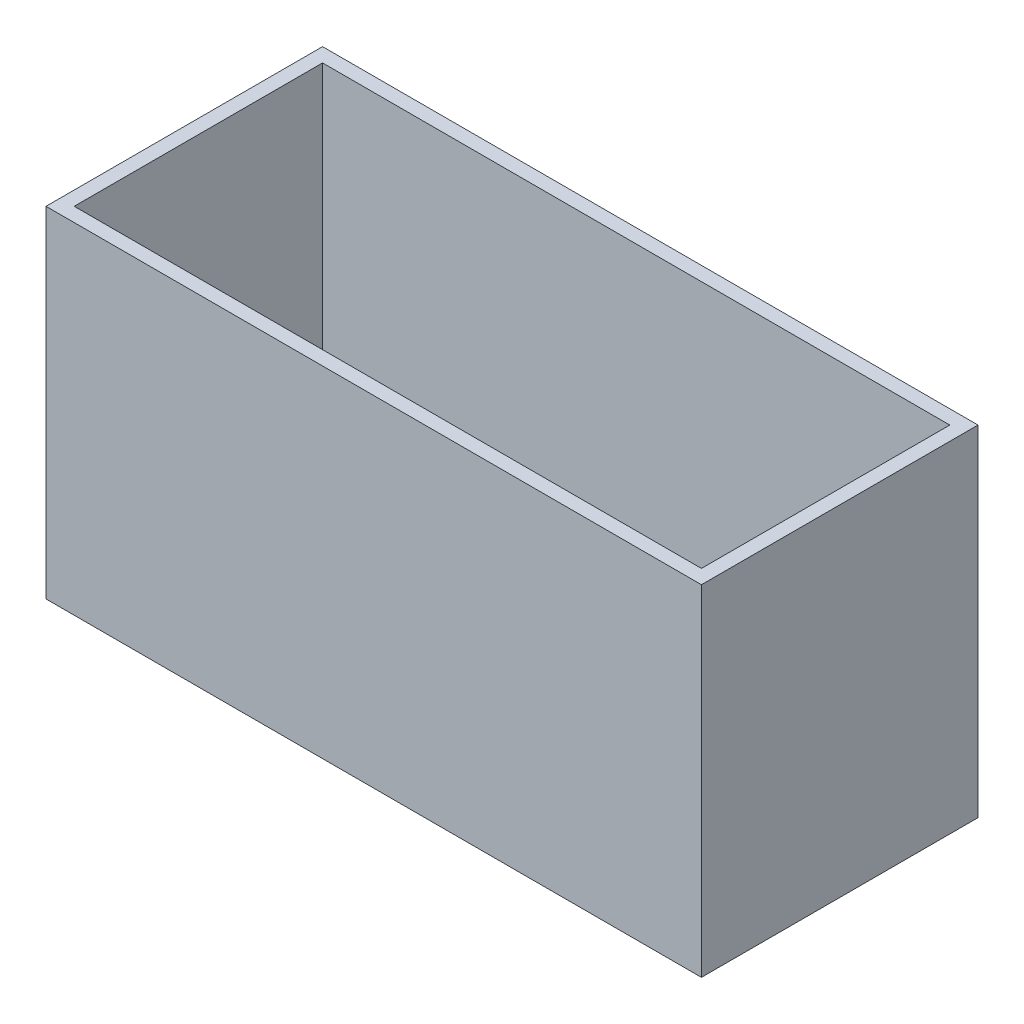
ISO-10303-21;
HEADER;
FILE_DESCRIPTION(('STEP AP214'),'2;1');
FILE_NAME('part.step','',(''),(''),'','','');
FILE_SCHEMA(('AUTOMOTIVE_DESIGN { 1 0 10303 214 1 1 1 1 }'));
ENDSEC;
DATA;
#1=APPLICATION_CONTEXT('core data for automotive mechanical design processes');
#2=APPLICATION_PROTOCOL_DEFINITION('international standard','automotive_design',2000,#1);
#3=PRODUCT_CONTEXT('',#1,'mechanical');
#4=PRODUCT('Part','Part','',(#3));
#5=PRODUCT_RELATED_PRODUCT_CATEGORY('part','',(#4));
#6=PRODUCT_DEFINITION_FORMATION('','',#4);
#7=PRODUCT_DEFINITION_CONTEXT('part definition',#1,'design');
#8=PRODUCT_DEFINITION('design','',#6,#7);
#9=PRODUCT_DEFINITION_SHAPE('','',#8);
#10=(LENGTH_UNIT() NAMED_UNIT(*) SI_UNIT(.MILLI.,.METRE.));
#11=(NAMED_UNIT(*) PLANE_ANGLE_UNIT() SI_UNIT($,.RADIAN.));
#12=(NAMED_UNIT(*) SI_UNIT($,.STERADIAN.) SOLID_ANGLE_UNIT());
#13=UNCERTAINTY_MEASURE_WITH_UNIT(LENGTH_MEASURE(1.E-05),#10,'distance_accuracy_value','');
#14=(GEOMETRIC_REPRESENTATION_CONTEXT(3) GLOBAL_UNCERTAINTY_ASSIGNED_CONTEXT((#13)) GLOBAL_UNIT_ASSIGNED_CONTEXT((#10,
#11,#12)) REPRESENTATION_CONTEXT('',''));
#15=CARTESIAN_POINT('',(0.,0.,0.));
#16=DIRECTION('',(0.,0.,1.));
#17=DIRECTION('',(1.,0.,0.));
#18=AXIS2_PLACEMENT_3D('',#15,#16,#17);
#19=CARTESIAN_POINT('',(0.,20.,0.));
#20=DIRECTION('',(0.,-1.,0.));
#21=DIRECTION('',(0.,0.,-1.));
#22=AXIS2_PLACEMENT_3D('',#19,#20,#21);
#23=PLANE('',#22);
#24=DIRECTION('',(0.,0.,-1.));
#25=VECTOR('',#24,1.);
#26=CARTESIAN_POINT('',(-444.5,20.,0.));
#27=LINE('',#26,#25);
#28=CARTESIAN_POINT('',(-444.5,20.,176.));
#29=VERTEX_POINT('',#28);
#30=CARTESIAN_POINT('',(-444.5,20.,-176.));
#31=VERTEX_POINT('',#30);
#32=EDGE_CURVE('E130',#29,#31,#27,.T.);
#33=ORIENTED_EDGE('',*,*,#32,.F.);
#34=DIRECTION('',(-1.,0.,0.));
#35=VECTOR('',#34,1.);
#36=CARTESIAN_POINT('',(0.,20.,176.));
#37=LINE('',#36,#35);
#38=CARTESIAN_POINT('',(444.5,20.,176.));
#39=VERTEX_POINT('',#38);
#40=EDGE_CURVE('E188',#39,#29,#37,.T.);
#41=ORIENTED_EDGE('',*,*,#40,.F.);
#42=DIRECTION('',(0.,0.,1.));
#43=VECTOR('',#42,1.);
#44=CARTESIAN_POINT('',(444.5,20.,0.));
#45=LINE('',#44,#43);
#46=CARTESIAN_POINT('',(444.5,20.,-176.));
#47=VERTEX_POINT('',#46);
#48=EDGE_CURVE('E194',#47,#39,#45,.T.);
#49=ORIENTED_EDGE('',*,*,#48,.F.);
#50=DIRECTION('',(1.,0.,0.));
#51=VECTOR('',#50,1.);
#52=CARTESIAN_POINT('',(0.,20.,-176.));
#53=LINE('',#52,#51);
#54=EDGE_CURVE('E140',#31,#47,#53,.T.);
#55=ORIENTED_EDGE('',*,*,#54,.F.);
#56=EDGE_LOOP('',(#33,#41,#49,#55));
#57=FACE_BOUND('',#56,.T.);
#58=ADVANCED_FACE('F45',(#57),#23,.F.);
#59=CARTESIAN_POINT('',(-464.5,482.,-176.));
#60=DIRECTION('',(0.,0.,-1.));
#61=DIRECTION('',(-1.,0.,0.));
#62=AXIS2_PLACEMENT_3D('',#59,#60,#61);
#63=PLANE('',#62);
#64=DIRECTION('',(0.,-1.,0.));
#65=VECTOR('',#64,1.);
#66=CARTESIAN_POINT('',(-444.5,482.,-176.));
#67=LINE('',#66,#65);
#68=CARTESIAN_POINT('',(-444.5,482.,-176.));
#69=VERTEX_POINT('',#68);
#70=EDGE_CURVE('E127',#69,#31,#67,.T.);
#71=ORIENTED_EDGE('',*,*,#70,.T.);
#72=ORIENTED_EDGE('',*,*,#54,.T.);
#73=DIRECTION('',(0.,-1.,0.));
#74=VECTOR('',#73,1.);
#75=CARTESIAN_POINT('',(444.5,482.,-176.));
#76=LINE('',#75,#74);
#77=CARTESIAN_POINT('',(444.5,482.,-176.));
#78=VERTEX_POINT('',#77);
#79=EDGE_CURVE('E138',#78,#47,#76,.T.);
#80=ORIENTED_EDGE('',*,*,#79,.F.);
#81=DIRECTION('',(1.,0.,0.));
#82=VECTOR('',#81,1.);
#83=CARTESIAN_POINT('',(-464.5,482.,-176.));
#84=LINE('',#83,#82);
#85=EDGE_CURVE('E118',#69,#78,#84,.T.);
#86=ORIENTED_EDGE('',*,*,#85,.F.);
#87=EDGE_LOOP('',(#71,#72,#80,#86));
#88=FACE_BOUND('',#87,.T.);
#89=ADVANCED_FACE('F136',(#88),#63,.F.);
#90=CARTESIAN_POINT('',(-464.5,482.,176.));
#91=DIRECTION('',(0.,0.,1.));
#92=DIRECTION('',(1.,0.,0.));
#93=AXIS2_PLACEMENT_3D('',#90,#91,#92);
#94=PLANE('',#93);
#95=DIRECTION('',(0.,-1.,0.));
#96=VECTOR('',#95,1.);
#97=CARTESIAN_POINT('',(-444.5,482.,176.));
#98=LINE('',#97,#96);
#99=CARTESIAN_POINT('',(-444.5,482.,176.));
#100=VERTEX_POINT('',#99);
#101=EDGE_CURVE('E124',#100,#29,#98,.T.);
#102=ORIENTED_EDGE('',*,*,#101,.F.);
#103=DIRECTION('',(-1.,0.,0.));
#104=VECTOR('',#103,1.);
#105=CARTESIAN_POINT('',(-464.5,482.,176.));
#106=LINE('',#105,#104);
#107=CARTESIAN_POINT('',(444.5,482.,176.));
#108=VERTEX_POINT('',#107);
#109=EDGE_CURVE('E120',#108,#100,#106,.T.);
#110=ORIENTED_EDGE('',*,*,#109,.F.);
#111=DIRECTION('',(0.,-1.,0.));
#112=VECTOR('',#111,1.);
#113=CARTESIAN_POINT('',(444.5,482.,176.));
#114=LINE('',#113,#112);
#115=EDGE_CURVE('E61',#108,#39,#114,.T.);
#116=ORIENTED_EDGE('',*,*,#115,.T.);
#117=ORIENTED_EDGE('',*,*,#40,.T.);
#118=EDGE_LOOP('',(#102,#110,#116,#117));
#119=FACE_BOUND('',#118,.T.);
#120=ADVANCED_FACE('F208',(#119),#94,.F.);
#121=CARTESIAN_POINT('',(464.5,20.,196.));
#122=DIRECTION('',(-1.,0.,0.));
#123=DIRECTION('',(0.,0.,1.));
#124=AXIS2_PLACEMENT_3D('',#121,#122,#123);
#125=PLANE('',#124);
#126=DIRECTION('',(0.,0.,-1.));
#127=VECTOR('',#126,1.);
#128=CARTESIAN_POINT('',(464.5,0.,196.));
#129=LINE('',#128,#127);
#130=CARTESIAN_POINT('',(464.5,0.,196.));
#131=VERTEX_POINT('',#130);
#132=CARTESIAN_POINT('',(464.5,0.,-196.));
#133=VERTEX_POINT('',#132);
#134=EDGE_CURVE('E145',#131,#133,#129,.T.);
#135=ORIENTED_EDGE('',*,*,#134,.T.);
#136=DIRECTION('',(0.,-1.,0.));
#137=VECTOR('',#136,1.);
#138=CARTESIAN_POINT('',(464.5,20.,-196.));
#139=LINE('',#138,#137);
#140=CARTESIAN_POINT('',(464.5,482.,-196.));
#141=VERTEX_POINT('',#140);
#142=EDGE_CURVE('E11',#141,#133,#139,.T.);
#143=ORIENTED_EDGE('',*,*,#142,.F.);
#144=DIRECTION('',(0.,0.,-1.));
#145=VECTOR('',#144,1.);
#146=CARTESIAN_POINT('',(464.5,482.,-176.));
#147=LINE('',#146,#145);
#148=CARTESIAN_POINT('',(464.5,482.,196.));
#149=VERTEX_POINT('',#148);
#150=EDGE_CURVE('E182',#149,#141,#147,.T.);
#151=ORIENTED_EDGE('',*,*,#150,.F.);
#152=DIRECTION('',(0.,-1.,0.));
#153=VECTOR('',#152,1.);
#154=CARTESIAN_POINT('',(464.5,20.,196.));
#155=LINE('',#154,#153);
#156=EDGE_CURVE('E161',#149,#131,#155,.T.);
#157=ORIENTED_EDGE('',*,*,#156,.T.);
#158=EDGE_LOOP('',(#135,#143,#151,#157));
#159=FACE_BOUND('',#158,.T.);
#160=ADVANCED_FACE('F47',(#159),#125,.F.);
#161=CARTESIAN_POINT('',(-464.5,20.,-196.));
#162=DIRECTION('',(0.,0.,1.));
#163=DIRECTION('',(1.,0.,0.));
#164=AXIS2_PLACEMENT_3D('',#161,#162,#163);
#165=PLANE('',#164);
#166=DIRECTION('',(-1.,0.,0.));
#167=VECTOR('',#166,1.);
#168=CARTESIAN_POINT('',(-464.5,0.,-196.));
#169=LINE('',#168,#167);
#170=CARTESIAN_POINT('',(-464.5,0.,-196.));
#171=VERTEX_POINT('',#170);
#172=EDGE_CURVE('E153',#133,#171,#169,.T.);
#173=ORIENTED_EDGE('',*,*,#172,.T.);
#174=DIRECTION('',(0.,-1.,0.));
#175=VECTOR('',#174,1.);
#176=CARTESIAN_POINT('',(-464.5,20.,-196.));
#177=LINE('',#176,#175);
#178=CARTESIAN_POINT('',(-464.5,482.,-196.));
#179=VERTEX_POINT('',#178);
#180=EDGE_CURVE('E54',#179,#171,#177,.T.);
#181=ORIENTED_EDGE('',*,*,#180,.F.);
#182=DIRECTION('',(-1.,0.,0.));
#183=VECTOR('',#182,1.);
#184=CARTESIAN_POINT('',(-464.5,482.,-196.));
#185=LINE('',#184,#183);
#186=EDGE_CURVE('E147',#141,#179,#185,.T.);
#187=ORIENTED_EDGE('',*,*,#186,.F.);
#188=ORIENTED_EDGE('',*,*,#142,.T.);
#189=EDGE_LOOP('',(#173,#181,#187,#188));
#190=FACE_BOUND('',#189,.T.);
#191=ADVANCED_FACE('F200',(#190),#165,.F.);
#192=CARTESIAN_POINT('',(-464.5,20.,196.));
#193=DIRECTION('',(1.,0.,0.));
#194=DIRECTION('',(0.,0.,-1.));
#195=AXIS2_PLACEMENT_3D('',#192,#193,#194);
#196=PLANE('',#195);
#197=DIRECTION('',(0.,-1.,0.));
#198=VECTOR('',#197,1.);
#199=CARTESIAN_POINT('',(-464.5,20.,196.));
#200=LINE('',#199,#198);
#201=CARTESIAN_POINT('',(-464.5,482.,196.));
#202=VERTEX_POINT('',#201);
#203=CARTESIAN_POINT('',(-464.5,0.,196.));
#204=VERTEX_POINT('',#203);
#205=EDGE_CURVE('E164',#202,#204,#200,.T.);
#206=ORIENTED_EDGE('',*,*,#205,.F.);
#207=DIRECTION('',(0.,0.,1.));
#208=VECTOR('',#207,1.);
#209=CARTESIAN_POINT('',(-464.5,482.,-176.));
#210=LINE('',#209,#208);
#211=EDGE_CURVE('E141',#179,#202,#210,.T.);
#212=ORIENTED_EDGE('',*,*,#211,.F.);
#213=ORIENTED_EDGE('',*,*,#180,.T.);
#214=DIRECTION('',(0.,0.,1.));
#215=VECTOR('',#214,1.);
#216=CARTESIAN_POINT('',(-464.5,0.,196.));
#217=LINE('',#216,#215);
#218=EDGE_CURVE('E156',#171,#204,#217,.T.);
#219=ORIENTED_EDGE('',*,*,#218,.T.);
#220=EDGE_LOOP('',(#206,#212,#213,#219));
#221=FACE_BOUND('',#220,.T.);
#222=ADVANCED_FACE('F172',(#221),#196,.F.);
#223=CARTESIAN_POINT('',(-464.5,20.,196.));
#224=DIRECTION('',(0.,0.,-1.));
#225=DIRECTION('',(-1.,0.,0.));
#226=AXIS2_PLACEMENT_3D('',#223,#224,#225);
#227=PLANE('',#226);
#228=DIRECTION('',(1.,0.,0.));
#229=VECTOR('',#228,1.);
#230=CARTESIAN_POINT('',(-464.5,0.,196.));
#231=LINE('',#230,#229);
#232=EDGE_CURVE('E69',#204,#131,#231,.T.);
#233=ORIENTED_EDGE('',*,*,#232,.T.);
#234=ORIENTED_EDGE('',*,*,#156,.F.);
#235=DIRECTION('',(1.,0.,0.));
#236=VECTOR('',#235,1.);
#237=CARTESIAN_POINT('',(-464.5,482.,196.));
#238=LINE('',#237,#236);
#239=EDGE_CURVE('E186',#202,#149,#238,.T.);
#240=ORIENTED_EDGE('',*,*,#239,.F.);
#241=ORIENTED_EDGE('',*,*,#205,.T.);
#242=EDGE_LOOP('',(#233,#234,#240,#241));
#243=FACE_BOUND('',#242,.T.);
#244=ADVANCED_FACE('F185',(#243),#227,.F.);
#245=CARTESIAN_POINT('',(0.,0.,0.));
#246=DIRECTION('',(0.,-1.,0.));
#247=DIRECTION('',(0.,0.,-1.));
#248=AXIS2_PLACEMENT_3D('',#245,#246,#247);
#249=PLANE('',#248);
#250=ORIENTED_EDGE('',*,*,#232,.F.);
#251=ORIENTED_EDGE('',*,*,#218,.F.);
#252=ORIENTED_EDGE('',*,*,#172,.F.);
#253=ORIENTED_EDGE('',*,*,#134,.F.);
#254=EDGE_LOOP('',(#250,#251,#252,#253));
#255=FACE_BOUND('',#254,.T.);
#256=ADVANCED_FACE('F178',(#255),#249,.T.);
#257=CARTESIAN_POINT('',(0.,482.,0.));
#258=DIRECTION('',(0.,-1.,0.));
#259=DIRECTION('',(0.,0.,-1.));
#260=AXIS2_PLACEMENT_3D('',#257,#258,#259);
#261=PLANE('',#260);
#262=DIRECTION('',(0.,0.,-1.));
#263=VECTOR('',#262,1.);
#264=CARTESIAN_POINT('',(-444.5,482.,176.));
#265=LINE('',#264,#263);
#266=EDGE_CURVE('E113',#100,#69,#265,.T.);
#267=ORIENTED_EDGE('',*,*,#266,.T.);
#268=ORIENTED_EDGE('',*,*,#85,.T.);
#269=DIRECTION('',(0.,0.,1.));
#270=VECTOR('',#269,1.);
#271=CARTESIAN_POINT('',(444.5,482.,176.));
#272=LINE('',#271,#270);
#273=EDGE_CURVE('E330',#78,#108,#272,.T.);
#274=ORIENTED_EDGE('',*,*,#273,.T.);
#275=ORIENTED_EDGE('',*,*,#109,.T.);
#276=EDGE_LOOP('',(#267,#268,#274,#275));
#277=FACE_BOUND('',#276,.T.);
#278=ORIENTED_EDGE('',*,*,#150,.T.);
#279=ORIENTED_EDGE('',*,*,#186,.T.);
#280=ORIENTED_EDGE('',*,*,#211,.T.);
#281=ORIENTED_EDGE('',*,*,#239,.T.);
#282=EDGE_LOOP('',(#278,#279,#280,#281));
#283=FACE_BOUND('',#282,.T.);
#284=ADVANCED_FACE('F115',(#277,#283),#261,.F.);
#285=CARTESIAN_POINT('',(444.5,482.,176.));
#286=DIRECTION('',(1.,0.,0.));
#287=DIRECTION('',(0.,0.,-1.));
#288=AXIS2_PLACEMENT_3D('',#285,#286,#287);
#289=PLANE('',#288);
#290=ORIENTED_EDGE('',*,*,#79,.T.);
#291=ORIENTED_EDGE('',*,*,#48,.T.);
#292=ORIENTED_EDGE('',*,*,#115,.F.);
#293=ORIENTED_EDGE('',*,*,#273,.F.);
#294=EDGE_LOOP('',(#290,#291,#292,#293));
#295=FACE_BOUND('',#294,.T.);
#296=ADVANCED_FACE('F234',(#295),#289,.F.);
#297=CARTESIAN_POINT('',(-444.5,482.,176.));
#298=DIRECTION('',(-1.,0.,0.));
#299=DIRECTION('',(0.,0.,1.));
#300=AXIS2_PLACEMENT_3D('',#297,#298,#299);
#301=PLANE('',#300);
#302=ORIENTED_EDGE('',*,*,#101,.T.);
#303=ORIENTED_EDGE('',*,*,#32,.T.);
#304=ORIENTED_EDGE('',*,*,#70,.F.);
#305=ORIENTED_EDGE('',*,*,#266,.F.);
#306=EDGE_LOOP('',(#302,#303,#304,#305));
#307=FACE_BOUND('',#306,.T.);
#308=ADVANCED_FACE('F128',(#307),#301,.F.);
#309=CLOSED_SHELL('',(#58,#89,#120,#160,#191,#222,#244,#256,#284,#296,#308));
#310=MANIFOLD_SOLID_BREP('B2',#309);
#311=ADVANCED_BREP_SHAPE_REPRESENTATION('',(#18,#310),#14);
#312=SHAPE_DEFINITION_REPRESENTATION(#9,#311);
ENDSEC;
END-ISO-10303-21;
